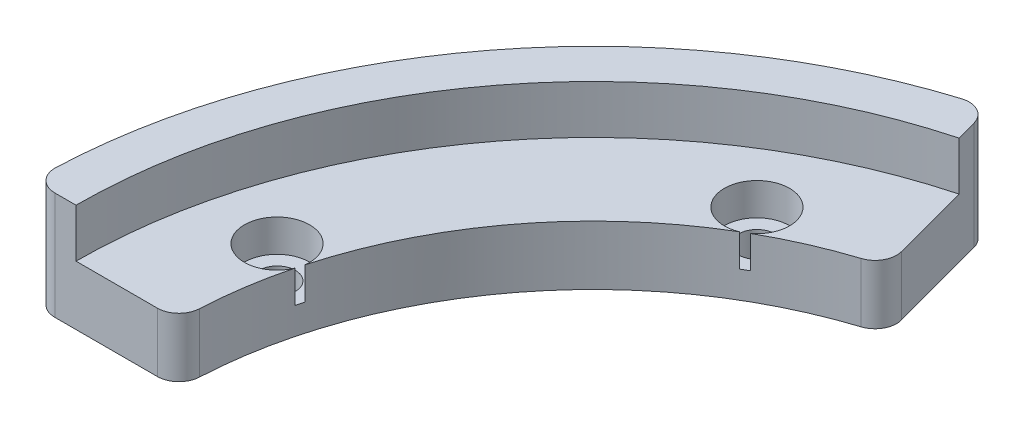
ISO-10303-21;
HEADER;
FILE_DESCRIPTION(('STEP AP214'),'2;1');
FILE_NAME('part.step','',(''),(''),'','','');
FILE_SCHEMA(('AUTOMOTIVE_DESIGN { 1 0 10303 214 1 1 1 1 }'));
ENDSEC;
DATA;
#1=APPLICATION_CONTEXT('core data for automotive mechanical design processes');
#2=APPLICATION_PROTOCOL_DEFINITION('international standard','automotive_design',2000,#1);
#3=PRODUCT_CONTEXT('',#1,'mechanical');
#4=PRODUCT('Part','Part','',(#3));
#5=PRODUCT_RELATED_PRODUCT_CATEGORY('part','',(#4));
#6=PRODUCT_DEFINITION_FORMATION('','',#4);
#7=PRODUCT_DEFINITION_CONTEXT('part definition',#1,'design');
#8=PRODUCT_DEFINITION('design','',#6,#7);
#9=PRODUCT_DEFINITION_SHAPE('','',#8);
#10=(LENGTH_UNIT() NAMED_UNIT(*) SI_UNIT(.MILLI.,.METRE.));
#11=(NAMED_UNIT(*) PLANE_ANGLE_UNIT() SI_UNIT($,.RADIAN.));
#12=(NAMED_UNIT(*) SI_UNIT($,.STERADIAN.) SOLID_ANGLE_UNIT());
#13=UNCERTAINTY_MEASURE_WITH_UNIT(LENGTH_MEASURE(1.E-05),#10,'distance_accuracy_value','');
#14=(GEOMETRIC_REPRESENTATION_CONTEXT(3) GLOBAL_UNCERTAINTY_ASSIGNED_CONTEXT((#13)) GLOBAL_UNIT_ASSIGNED_CONTEXT((#10,
#11,#12)) REPRESENTATION_CONTEXT('',''));
#15=CARTESIAN_POINT('',(0.,0.,0.));
#16=DIRECTION('',(0.,0.,1.));
#17=DIRECTION('',(1.,0.,0.));
#18=AXIS2_PLACEMENT_3D('',#15,#16,#17);
#19=CARTESIAN_POINT('',(-13.4585903453309,0.,-50.2281429670316));
#20=DIRECTION('',(0.,-1.,0.));
#21=DIRECTION('',(0.,0.,-1.));
#22=AXIS2_PLACEMENT_3D('',#19,#20,#21);
#23=PLANE('',#22);
#24=CARTESIAN_POINT('',(-20.7500000000013,0.,-35.9400542570549));
#25=DIRECTION('',(0.,1.,0.));
#26=DIRECTION('',(0.,0.,1.));
#27=AXIS2_PLACEMENT_3D('',#24,#25,#26);
#28=CIRCLE('',#27,1.70000000000001);
#29=CARTESIAN_POINT('',(-20.7500000000013,0.,-34.2400542570549));
#30=VERTEX_POINT('',#29);
#31=EDGE_CURVE('E332',#30,#30,#28,.T.);
#32=ORIENTED_EDGE('',*,*,#31,.T.);
#33=EDGE_LOOP('',(#32));
#34=FACE_BOUND('',#33,.T.);
#35=CARTESIAN_POINT('',(0.,0.,0.));
#36=DIRECTION('',(0.,1.,0.));
#37=DIRECTION('',(0.,0.,1.));
#38=AXIS2_PLACEMENT_3D('',#35,#36,#37);
#39=CIRCLE('',#38,52.);
#40=CARTESIAN_POINT('',(-15.4569448815382,0.,-49.6496007529677));
#41=VERTEX_POINT('',#40);
#42=CARTESIAN_POINT('',(-51.9583833466747,0.,-2.08));
#43=VERTEX_POINT('',#42);
#44=EDGE_CURVE('E245',#41,#43,#39,.T.);
#45=ORIENTED_EDGE('',*,*,#44,.F.);
#46=CARTESIAN_POINT('',(-14.862447001479,0.,-47.7400007240074));
#47=DIRECTION('',(0.,-1.,0.));
#48=DIRECTION('',(0.,0.,-1.));
#49=AXIS2_PLACEMENT_3D('',#46,#47,#48);
#50=CIRCLE('',#49,2.);
#51=CARTESIAN_POINT('',(-12.9305953489009,0.,-48.2576388142125));
#52=VERTEX_POINT('',#51);
#53=EDGE_CURVE('E178',#41,#52,#50,.T.);
#54=ORIENTED_EDGE('',*,*,#53,.T.);
#55=DIRECTION('',(0.258819045102518,0.,0.965925826289069));
#56=VECTOR('',#55,1.);
#57=CARTESIAN_POINT('',(-13.4585903453309,0.,-50.2281429670316));
#58=LINE('',#57,#56);
#59=CARTESIAN_POINT('',(-10.4693823375046,0.,-39.0722668074319));
#60=VERTEX_POINT('',#59);
#61=EDGE_CURVE('E221',#52,#60,#58,.T.);
#62=ORIENTED_EDGE('',*,*,#61,.T.);
#63=CARTESIAN_POINT('',(-12.4012339900827,0.,-38.5546287172269));
#64=DIRECTION('',(0.,-1.,0.));
#65=DIRECTION('',(0.,0.,-1.));
#66=AXIS2_PLACEMENT_3D('',#63,#64,#65);
#67=CIRCLE('',#66,2.);
#68=CARTESIAN_POINT('',(-11.7888273732885,0.,-36.6506964348947));
#69=VERTEX_POINT('',#68);
#70=EDGE_CURVE('E176',#60,#69,#67,.T.);
#71=ORIENTED_EDGE('',*,*,#70,.T.);
#72=CARTESIAN_POINT('',(0.,0.,0.));
#73=DIRECTION('',(0.,1.,0.));
#74=DIRECTION('',(0.,0.,1.));
#75=AXIS2_PLACEMENT_3D('',#72,#73,#74);
#76=CIRCLE('',#75,38.5);
#77=CARTESIAN_POINT('',(-38.4530272815785,0.,-1.90123456790123));
#78=VERTEX_POINT('',#77);
#79=EDGE_CURVE('E241',#69,#78,#76,.T.);
#80=ORIENTED_EDGE('',*,*,#79,.T.);
#81=CARTESIAN_POINT('',(-40.4505871403618,0.,-2.));
#82=DIRECTION('',(0.,-1.,0.));
#83=DIRECTION('',(0.,0.,-1.));
#84=AXIS2_PLACEMENT_3D('',#81,#82,#83);
#85=CIRCLE('',#84,2.);
#86=CARTESIAN_POINT('',(-40.4505871403618,0.,0.));
#87=VERTEX_POINT('',#86);
#88=EDGE_CURVE('E172',#78,#87,#85,.T.);
#89=ORIENTED_EDGE('',*,*,#88,.T.);
#90=DIRECTION('',(1.,0.,0.));
#91=VECTOR('',#90,1.);
#92=CARTESIAN_POINT('',(-52.,0.,0.));
#93=LINE('',#92,#91);
#94=CARTESIAN_POINT('',(-49.9599839871872,0.,0.));
#95=VERTEX_POINT('',#94);
#96=EDGE_CURVE('E202',#95,#87,#93,.T.);
#97=ORIENTED_EDGE('',*,*,#96,.F.);
#98=CARTESIAN_POINT('',(-49.9599839871872,0.,-2.));
#99=DIRECTION('',(0.,-1.,0.));
#100=DIRECTION('',(0.,0.,-1.));
#101=AXIS2_PLACEMENT_3D('',#98,#99,#100);
#102=CIRCLE('',#101,2.);
#103=EDGE_CURVE('E174',#95,#43,#102,.T.);
#104=ORIENTED_EDGE('',*,*,#103,.T.);
#105=EDGE_LOOP('',(#45,#54,#62,#71,#80,#89,#97,#104));
#106=FACE_BOUND('',#105,.T.);
#107=CARTESIAN_POINT('',(-40.0859217909964,0.,-10.7409903717543));
#108=DIRECTION('',(0.,1.,0.));
#109=DIRECTION('',(0.,0.,1.));
#110=AXIS2_PLACEMENT_3D('',#107,#108,#109);
#111=CIRCLE('',#110,1.70000000000001);
#112=CARTESIAN_POINT('',(-40.0859217909964,0.,-9.04099037175433));
#113=VERTEX_POINT('',#112);
#114=EDGE_CURVE('E216',#113,#113,#111,.T.);
#115=ORIENTED_EDGE('',*,*,#114,.T.);
#116=EDGE_LOOP('',(#115));
#117=FACE_BOUND('',#116,.T.);
#118=ADVANCED_FACE('F37',(#34,#106,#117),#23,.T.);
#119=CARTESIAN_POINT('',(0.,0.,0.));
#120=DIRECTION('',(0.,1.,0.));
#121=DIRECTION('',(0.,0.,1.));
#122=AXIS2_PLACEMENT_3D('',#119,#120,#121);
#123=CYLINDRICAL_SURFACE('',#122,52.);
#124=CARTESIAN_POINT('',(0.,10.,0.));
#125=DIRECTION('',(0.,1.,0.));
#126=DIRECTION('',(0.,0.,1.));
#127=AXIS2_PLACEMENT_3D('',#124,#125,#126);
#128=CIRCLE('',#127,52.);
#129=CARTESIAN_POINT('',(-15.4569448815382,10.,-49.6496007529677));
#130=VERTEX_POINT('',#129);
#131=CARTESIAN_POINT('',(-51.9583833466747,10.,-2.08));
#132=VERTEX_POINT('',#131);
#133=EDGE_CURVE('E232',#130,#132,#128,.T.);
#134=ORIENTED_EDGE('',*,*,#133,.F.);
#135=DIRECTION('',(0.,1.,0.));
#136=VECTOR('',#135,1.);
#137=CARTESIAN_POINT('',(-15.4569448815382,0.,-49.6496007529677));
#138=LINE('',#137,#136);
#139=EDGE_CURVE('E164',#130,#41,#138,.F.);
#140=ORIENTED_EDGE('',*,*,#139,.T.);
#141=ORIENTED_EDGE('',*,*,#44,.T.);
#142=DIRECTION('',(0.,1.,0.));
#143=VECTOR('',#142,1.);
#144=CARTESIAN_POINT('',(-51.9583833466747,0.,-2.08));
#145=LINE('',#144,#143);
#146=EDGE_CURVE('E162',#43,#132,#145,.T.);
#147=ORIENTED_EDGE('',*,*,#146,.T.);
#148=EDGE_LOOP('',(#134,#140,#141,#147));
#149=FACE_BOUND('',#148,.T.);
#150=ADVANCED_FACE('F287',(#149),#123,.T.);
#151=CARTESIAN_POINT('',(0.,0.,0.));
#152=DIRECTION('',(0.,1.,0.));
#153=DIRECTION('',(0.,0.,1.));
#154=AXIS2_PLACEMENT_3D('',#151,#152,#153);
#155=CYLINDRICAL_SURFACE('',#154,38.5);
#156=ORIENTED_EDGE('',*,*,#79,.F.);
#157=DIRECTION('',(0.,1.,0.));
#158=VECTOR('',#157,1.);
#159=CARTESIAN_POINT('',(-11.7888273732885,0.,-36.6506964348947));
#160=LINE('',#159,#158);
#161=CARTESIAN_POINT('',(-11.7888273732885,5.5,-36.6506964348947));
#162=VERTEX_POINT('',#161);
#163=EDGE_CURVE('E190',#69,#162,#160,.T.);
#164=ORIENTED_EDGE('',*,*,#163,.T.);
#165=CARTESIAN_POINT('',(0.,5.5,0.));
#166=DIRECTION('',(0.,1.,0.));
#167=DIRECTION('',(0.,0.,1.));
#168=AXIS2_PLACEMENT_3D('',#165,#166,#167);
#169=CIRCLE('',#168,38.5);
#170=CARTESIAN_POINT('',(-18.9253645489168,5.5,-33.5273109075363));
#171=VERTEX_POINT('',#170);
#172=EDGE_CURVE('E239',#162,#171,#169,.T.);
#173=ORIENTED_EDGE('',*,*,#172,.T.);
#174=DIRECTION('',(0.,1.,0.));
#175=VECTOR('',#174,1.);
#176=CARTESIAN_POINT('',(-18.9253645489168,4.,-33.5273109075363));
#177=LINE('',#176,#175);
#178=CARTESIAN_POINT('',(-18.9253645489168,2.5,-33.5273109075363));
#179=VERTEX_POINT('',#178);
#180=EDGE_CURVE('E152',#179,#171,#177,.T.);
#181=ORIENTED_EDGE('',*,*,#180,.F.);
#182=CARTESIAN_POINT('',(0.,2.5,0.));
#183=DIRECTION('',(0.,-1.,0.));
#184=DIRECTION('',(0.,0.,-1.));
#185=AXIS2_PLACEMENT_3D('',#182,#183,#184);
#186=CIRCLE('',#185,38.5);
#187=CARTESIAN_POINT('',(-19.5728206920484,2.5,-33.1535019290108));
#188=VERTEX_POINT('',#187);
#189=EDGE_CURVE('E157',#188,#179,#186,.T.);
#190=ORIENTED_EDGE('',*,*,#189,.F.);
#191=DIRECTION('',(0.,1.,0.));
#192=VECTOR('',#191,1.);
#193=CARTESIAN_POINT('',(-19.5728206920484,4.,-33.1535019290108));
#194=LINE('',#193,#192);
#195=CARTESIAN_POINT('',(-19.5728206920484,5.5,-33.1535019290108));
#196=VERTEX_POINT('',#195);
#197=EDGE_CURVE('E140',#196,#188,#194,.F.);
#198=ORIENTED_EDGE('',*,*,#197,.F.);
#199=CARTESIAN_POINT('',(-37.0896425066326,5.5,-10.3251352887114));
#200=VERTEX_POINT('',#199);
#201=EDGE_CURVE('E242',#196,#200,#169,.T.);
#202=ORIENTED_EDGE('',*,*,#201,.T.);
#203=DIRECTION('',(0.,1.,0.));
#204=VECTOR('',#203,1.);
#205=CARTESIAN_POINT('',(-37.0896425066326,4.,-10.3251352887114));
#206=LINE('',#205,#204);
#207=CARTESIAN_POINT('',(-37.0896425066326,2.5,-10.3251352887114));
#208=VERTEX_POINT('',#207);
#209=EDGE_CURVE('E248',#208,#200,#206,.T.);
#210=ORIENTED_EDGE('',*,*,#209,.F.);
#211=CARTESIAN_POINT('',(0.,2.5,0.));
#212=DIRECTION('',(0.,-1.,0.));
#213=DIRECTION('',(0.,0.,-1.));
#214=AXIS2_PLACEMENT_3D('',#211,#212,#213);
#215=CIRCLE('',#214,38.5);
#216=CARTESIAN_POINT('',(-37.2831402723828,2.5,-9.6029917957805));
#217=VERTEX_POINT('',#216);
#218=EDGE_CURVE('E251',#217,#208,#215,.T.);
#219=ORIENTED_EDGE('',*,*,#218,.F.);
#220=DIRECTION('',(0.,1.,0.));
#221=VECTOR('',#220,1.);
#222=CARTESIAN_POINT('',(-37.2831402723828,4.,-9.6029917957805));
#223=LINE('',#222,#221);
#224=CARTESIAN_POINT('',(-37.2831402723828,5.5,-9.6029917957805));
#225=VERTEX_POINT('',#224);
#226=EDGE_CURVE('E166',#225,#217,#223,.F.);
#227=ORIENTED_EDGE('',*,*,#226,.F.);
#228=CARTESIAN_POINT('',(-38.4530272815785,5.5,-1.90123456790123));
#229=VERTEX_POINT('',#228);
#230=EDGE_CURVE('E238',#225,#229,#169,.T.);
#231=ORIENTED_EDGE('',*,*,#230,.T.);
#232=DIRECTION('',(0.,1.,0.));
#233=VECTOR('',#232,1.);
#234=CARTESIAN_POINT('',(-38.4530272815785,0.,-1.90123456790123));
#235=LINE('',#234,#233);
#236=EDGE_CURVE('E188',#229,#78,#235,.F.);
#237=ORIENTED_EDGE('',*,*,#236,.T.);
#238=EDGE_LOOP('',(#156,#164,#173,#181,#190,#198,#202,#210,#219,#227,#231,#237));
#239=FACE_BOUND('',#238,.T.);
#240=ADVANCED_FACE('F161',(#239),#155,.F.);
#241=CARTESIAN_POINT('',(-9.96453323644692,5.5,-37.1881443121292));
#242=DIRECTION('',(0.,1.,0.));
#243=DIRECTION('',(0.,0.,1.));
#244=AXIS2_PLACEMENT_3D('',#241,#242,#243);
#245=PLANE('',#244);
#246=ORIENTED_EDGE('',*,*,#172,.F.);
#247=CARTESIAN_POINT('',(-12.4012339900827,5.5,-38.5546287172269));
#248=DIRECTION('',(0.,1.,0.));
#249=DIRECTION('',(0.,0.,1.));
#250=AXIS2_PLACEMENT_3D('',#247,#248,#249);
#251=CIRCLE('',#250,2.);
#252=CARTESIAN_POINT('',(-10.4693823375046,5.5,-39.0722668074319));
#253=VERTEX_POINT('',#252);
#254=EDGE_CURVE('E60',#162,#253,#251,.T.);
#255=ORIENTED_EDGE('',*,*,#254,.T.);
#256=DIRECTION('',(-0.258819045102518,0.,-0.965925826289069));
#257=VECTOR('',#256,1.);
#258=CARTESIAN_POINT('',(-9.96453323644692,5.5,-37.1881443121292));
#259=LINE('',#258,#257);
#260=CARTESIAN_POINT('',(-12.4233141649208,5.5,-46.3644396618753));
#261=VERTEX_POINT('',#260);
#262=EDGE_CURVE('E224',#253,#261,#259,.T.);
#263=ORIENTED_EDGE('',*,*,#262,.T.);
#264=CARTESIAN_POINT('',(0.,5.5,0.));
#265=DIRECTION('',(0.,1.,0.));
#266=DIRECTION('',(0.,0.,1.));
#267=AXIS2_PLACEMENT_3D('',#264,#265,#266);
#268=CIRCLE('',#267,48.);
#269=CARTESIAN_POINT('',(-48.,5.5,0.));
#270=VERTEX_POINT('',#269);
#271=EDGE_CURVE('E210',#261,#270,#268,.T.);
#272=ORIENTED_EDGE('',*,*,#271,.T.);
#273=DIRECTION('',(-1.,0.,0.));
#274=VECTOR('',#273,1.);
#275=CARTESIAN_POINT('',(-38.5,5.5,0.));
#276=LINE('',#275,#274);
#277=CARTESIAN_POINT('',(-40.4505871403618,5.5,0.));
#278=VERTEX_POINT('',#277);
#279=EDGE_CURVE('E199',#278,#270,#276,.T.);
#280=ORIENTED_EDGE('',*,*,#279,.F.);
#281=CARTESIAN_POINT('',(-40.4505871403618,5.5,-2.));
#282=DIRECTION('',(0.,1.,0.));
#283=DIRECTION('',(0.,0.,1.));
#284=AXIS2_PLACEMENT_3D('',#281,#282,#283);
#285=CIRCLE('',#284,2.);
#286=EDGE_CURVE('E52',#278,#229,#285,.T.);
#287=ORIENTED_EDGE('',*,*,#286,.T.);
#288=ORIENTED_EDGE('',*,*,#230,.F.);
#289=CARTESIAN_POINT('',(-40.0859217909964,5.5,-10.7409903717543));
#290=DIRECTION('',(0.,1.,0.));
#291=DIRECTION('',(0.,0.,1.));
#292=AXIS2_PLACEMENT_3D('',#289,#290,#291);
#293=CIRCLE('',#292,3.02500000000009);
#294=EDGE_CURVE('E151',#200,#225,#293,.T.);
#295=ORIENTED_EDGE('',*,*,#294,.F.);
#296=ORIENTED_EDGE('',*,*,#201,.F.);
#297=CARTESIAN_POINT('',(-20.7500000000013,5.5,-35.9400542570549));
#298=DIRECTION('',(0.,1.,0.));
#299=DIRECTION('',(0.,0.,1.));
#300=AXIS2_PLACEMENT_3D('',#297,#298,#299);
#301=CIRCLE('',#300,3.02500000000009);
#302=EDGE_CURVE('E147',#171,#196,#301,.T.);
#303=ORIENTED_EDGE('',*,*,#302,.F.);
#304=EDGE_LOOP('',(#246,#255,#263,#272,#280,#287,#288,#295,#296,#303));
#305=FACE_BOUND('',#304,.T.);
#306=ADVANCED_FACE('F206',(#305),#245,.T.);
#307=CARTESIAN_POINT('',(0.,0.,0.));
#308=DIRECTION('',(0.,1.,0.));
#309=DIRECTION('',(0.,0.,1.));
#310=AXIS2_PLACEMENT_3D('',#307,#308,#309);
#311=CYLINDRICAL_SURFACE('',#310,48.);
#312=CARTESIAN_POINT('',(0.,10.,0.));
#313=DIRECTION('',(0.,1.,0.));
#314=DIRECTION('',(0.,0.,1.));
#315=AXIS2_PLACEMENT_3D('',#312,#313,#314);
#316=CIRCLE('',#315,48.);
#317=CARTESIAN_POINT('',(-12.4233141649208,10.,-46.3644396618753));
#318=VERTEX_POINT('',#317);
#319=CARTESIAN_POINT('',(-48.,10.,0.));
#320=VERTEX_POINT('',#319);
#321=EDGE_CURVE('E235',#318,#320,#316,.T.);
#322=ORIENTED_EDGE('',*,*,#321,.T.);
#323=DIRECTION('',(0.,1.,0.));
#324=VECTOR('',#323,1.);
#325=CARTESIAN_POINT('',(-48.,5.5,0.));
#326=LINE('',#325,#324);
#327=EDGE_CURVE('E212',#270,#320,#326,.T.);
#328=ORIENTED_EDGE('',*,*,#327,.F.);
#329=ORIENTED_EDGE('',*,*,#271,.F.);
#330=DIRECTION('',(0.,1.,0.));
#331=VECTOR('',#330,1.);
#332=CARTESIAN_POINT('',(-12.4233141649208,5.5,-46.3644396618753));
#333=LINE('',#332,#331);
#334=EDGE_CURVE('E226',#261,#318,#333,.T.);
#335=ORIENTED_EDGE('',*,*,#334,.T.);
#336=EDGE_LOOP('',(#322,#328,#329,#335));
#337=FACE_BOUND('',#336,.T.);
#338=ADVANCED_FACE('F320',(#337),#311,.F.);
#339=CARTESIAN_POINT('',(-12.4233141649208,10.,-46.3644396618753));
#340=DIRECTION('',(0.,1.,0.));
#341=DIRECTION('',(0.,0.,1.));
#342=AXIS2_PLACEMENT_3D('',#339,#340,#341);
#343=PLANE('',#342);
#344=DIRECTION('',(-0.258819045102518,0.,-0.965925826289069));
#345=VECTOR('',#344,1.);
#346=CARTESIAN_POINT('',(-12.4233141649208,10.,-46.3644396618753));
#347=LINE('',#346,#345);
#348=CARTESIAN_POINT('',(-12.9305953489009,10.,-48.2576388142125));
#349=VERTEX_POINT('',#348);
#350=EDGE_CURVE('E229',#318,#349,#347,.T.);
#351=ORIENTED_EDGE('',*,*,#350,.T.);
#352=CARTESIAN_POINT('',(-14.862447001479,10.,-47.7400007240074));
#353=DIRECTION('',(0.,1.,0.));
#354=DIRECTION('',(0.,0.,1.));
#355=AXIS2_PLACEMENT_3D('',#352,#353,#354);
#356=CIRCLE('',#355,2.);
#357=EDGE_CURVE('E186',#349,#130,#356,.T.);
#358=ORIENTED_EDGE('',*,*,#357,.T.);
#359=ORIENTED_EDGE('',*,*,#133,.T.);
#360=CARTESIAN_POINT('',(-49.9599839871872,10.,-2.));
#361=DIRECTION('',(0.,1.,0.));
#362=DIRECTION('',(0.,0.,1.));
#363=AXIS2_PLACEMENT_3D('',#360,#361,#362);
#364=CIRCLE('',#363,2.);
#365=CARTESIAN_POINT('',(-49.9599839871872,10.,0.));
#366=VERTEX_POINT('',#365);
#367=EDGE_CURVE('E184',#132,#366,#364,.T.);
#368=ORIENTED_EDGE('',*,*,#367,.T.);
#369=DIRECTION('',(-1.,0.,0.));
#370=VECTOR('',#369,1.);
#371=CARTESIAN_POINT('',(-48.,10.,0.));
#372=LINE('',#371,#370);
#373=EDGE_CURVE('E214',#320,#366,#372,.T.);
#374=ORIENTED_EDGE('',*,*,#373,.F.);
#375=ORIENTED_EDGE('',*,*,#321,.F.);
#376=EDGE_LOOP('',(#351,#358,#359,#368,#374,#375));
#377=FACE_BOUND('',#376,.T.);
#378=ADVANCED_FACE('F317',(#377),#343,.T.);
#379=CARTESIAN_POINT('',(0.,0.,0.));
#380=DIRECTION('',(-0.965925826289069,0.,0.258819045102518));
#381=DIRECTION('',(0.258819045102518,0.,0.965925826289069));
#382=AXIS2_PLACEMENT_3D('',#379,#380,#381);
#383=PLANE('',#382);
#384=ORIENTED_EDGE('',*,*,#61,.F.);
#385=DIRECTION('',(0.,-1.,0.));
#386=VECTOR('',#385,1.);
#387=CARTESIAN_POINT('',(-12.9305953489009,10.,-48.2576388142125));
#388=LINE('',#387,#386);
#389=EDGE_CURVE('E182',#52,#349,#388,.F.);
#390=ORIENTED_EDGE('',*,*,#389,.T.);
#391=ORIENTED_EDGE('',*,*,#350,.F.);
#392=ORIENTED_EDGE('',*,*,#334,.F.);
#393=ORIENTED_EDGE('',*,*,#262,.F.);
#394=DIRECTION('',(0.,-1.,0.));
#395=VECTOR('',#394,1.);
#396=CARTESIAN_POINT('',(-10.4693823375046,0.,-39.0722668074319));
#397=LINE('',#396,#395);
#398=EDGE_CURVE('E180',#253,#60,#397,.T.);
#399=ORIENTED_EDGE('',*,*,#398,.T.);
#400=EDGE_LOOP('',(#384,#390,#391,#392,#393,#399));
#401=FACE_BOUND('',#400,.T.);
#402=ADVANCED_FACE('F330',(#401),#383,.F.);
#403=CARTESIAN_POINT('',(0.,0.,0.));
#404=DIRECTION('',(0.,0.,1.));
#405=DIRECTION('',(1.,0.,0.));
#406=AXIS2_PLACEMENT_3D('',#403,#404,#405);
#407=PLANE('',#406);
#408=ORIENTED_EDGE('',*,*,#373,.T.);
#409=DIRECTION('',(0.,1.,0.));
#410=VECTOR('',#409,1.);
#411=CARTESIAN_POINT('',(-49.9599839871872,0.,0.));
#412=LINE('',#411,#410);
#413=EDGE_CURVE('E11',#366,#95,#412,.F.);
#414=ORIENTED_EDGE('',*,*,#413,.T.);
#415=ORIENTED_EDGE('',*,*,#96,.T.);
#416=DIRECTION('',(0.,1.,0.));
#417=VECTOR('',#416,1.);
#418=CARTESIAN_POINT('',(-40.4505871403618,0.,0.));
#419=LINE('',#418,#417);
#420=EDGE_CURVE('E45',#87,#278,#419,.T.);
#421=ORIENTED_EDGE('',*,*,#420,.T.);
#422=ORIENTED_EDGE('',*,*,#279,.T.);
#423=ORIENTED_EDGE('',*,*,#327,.T.);
#424=EDGE_LOOP('',(#408,#414,#415,#421,#422,#423));
#425=FACE_BOUND('',#424,.T.);
#426=ADVANCED_FACE('F197',(#425),#407,.T.);
#427=CARTESIAN_POINT('',(-40.0859217909964,5.5,-10.7409903717543));
#428=DIRECTION('',(0.,1.,0.));
#429=DIRECTION('',(0.,0.,1.));
#430=AXIS2_PLACEMENT_3D('',#427,#428,#429);
#431=CYLINDRICAL_SURFACE('',#430,1.70000000000001);
#432=ORIENTED_EDGE('',*,*,#114,.F.);
#433=EDGE_LOOP('',(#432));
#434=FACE_BOUND('',#433,.T.);
#435=CARTESIAN_POINT('',(-40.0859217909964,2.5,-10.7409903717543));
#436=DIRECTION('',(0.,1.,0.));
#437=DIRECTION('',(0.,0.,1.));
#438=AXIS2_PLACEMENT_3D('',#435,#436,#437);
#439=CIRCLE('',#438,1.70000000000001);
#440=CARTESIAN_POINT('',(-40.0859217909964,2.5,-9.04099037175433));
#441=VERTEX_POINT('',#440);
#442=EDGE_CURVE('E264',#441,#441,#439,.T.);
#443=ORIENTED_EDGE('',*,*,#442,.T.);
#444=EDGE_LOOP('',(#443));
#445=FACE_BOUND('',#444,.T.);
#446=ADVANCED_FACE('F274',(#434,#445),#431,.F.);
#447=CARTESIAN_POINT('',(-38.3859217909964,2.5,-10.7409903717543));
#448=DIRECTION('',(0.,-1.,0.));
#449=DIRECTION('',(0.,0.,-1.));
#450=AXIS2_PLACEMENT_3D('',#447,#448,#449);
#451=PLANE('',#450);
#452=ORIENTED_EDGE('',*,*,#218,.T.);
#453=CARTESIAN_POINT('',(-40.0859217909964,2.5,-10.7409903717543));
#454=DIRECTION('',(0.,1.,0.));
#455=DIRECTION('',(0.,0.,1.));
#456=AXIS2_PLACEMENT_3D('',#453,#454,#455);
#457=CIRCLE('',#456,3.02500000000009);
#458=EDGE_CURVE('E257',#208,#217,#457,.T.);
#459=ORIENTED_EDGE('',*,*,#458,.T.);
#460=EDGE_LOOP('',(#452,#459));
#461=FACE_BOUND('',#460,.T.);
#462=ORIENTED_EDGE('',*,*,#442,.F.);
#463=EDGE_LOOP('',(#462));
#464=FACE_BOUND('',#463,.T.);
#465=ADVANCED_FACE('F261',(#461,#464),#451,.F.);
#466=CARTESIAN_POINT('',(-40.0859217909964,5.5,-10.7409903717543));
#467=DIRECTION('',(0.,1.,0.));
#468=DIRECTION('',(0.,0.,1.));
#469=AXIS2_PLACEMENT_3D('',#466,#467,#468);
#470=CYLINDRICAL_SURFACE('',#469,3.02500000000009);
#471=ORIENTED_EDGE('',*,*,#226,.T.);
#472=ORIENTED_EDGE('',*,*,#458,.F.);
#473=ORIENTED_EDGE('',*,*,#209,.T.);
#474=ORIENTED_EDGE('',*,*,#294,.T.);
#475=EDGE_LOOP('',(#471,#472,#473,#474));
#476=FACE_BOUND('',#475,.T.);
#477=ADVANCED_FACE('F256',(#476),#470,.F.);
#478=CARTESIAN_POINT('',(-20.7500000000013,5.5,-35.9400542570549));
#479=DIRECTION('',(0.,1.,0.));
#480=DIRECTION('',(0.,0.,1.));
#481=AXIS2_PLACEMENT_3D('',#478,#479,#480);
#482=CYLINDRICAL_SURFACE('',#481,1.70000000000001);
#483=ORIENTED_EDGE('',*,*,#31,.F.);
#484=EDGE_LOOP('',(#483));
#485=FACE_BOUND('',#484,.T.);
#486=CARTESIAN_POINT('',(-20.7500000000013,2.5,-35.9400542570549));
#487=DIRECTION('',(0.,1.,0.));
#488=DIRECTION('',(0.,0.,1.));
#489=AXIS2_PLACEMENT_3D('',#486,#487,#488);
#490=CIRCLE('',#489,1.70000000000001);
#491=CARTESIAN_POINT('',(-20.7500000000013,2.5,-34.2400542570549));
#492=VERTEX_POINT('',#491);
#493=EDGE_CURVE('E158',#492,#492,#490,.T.);
#494=ORIENTED_EDGE('',*,*,#493,.T.);
#495=EDGE_LOOP('',(#494));
#496=FACE_BOUND('',#495,.T.);
#497=ADVANCED_FACE('F284',(#485,#496),#482,.F.);
#498=CARTESIAN_POINT('',(-19.0500000000013,2.5,-35.9400542570549));
#499=DIRECTION('',(0.,-1.,0.));
#500=DIRECTION('',(0.,0.,-1.));
#501=AXIS2_PLACEMENT_3D('',#498,#499,#500);
#502=PLANE('',#501);
#503=ORIENTED_EDGE('',*,*,#189,.T.);
#504=CARTESIAN_POINT('',(-20.7500000000013,2.5,-35.9400542570549));
#505=DIRECTION('',(0.,1.,0.));
#506=DIRECTION('',(0.,0.,1.));
#507=AXIS2_PLACEMENT_3D('',#504,#505,#506);
#508=CIRCLE('',#507,3.02500000000009);
#509=EDGE_CURVE('E144',#179,#188,#508,.T.);
#510=ORIENTED_EDGE('',*,*,#509,.T.);
#511=EDGE_LOOP('',(#503,#510));
#512=FACE_BOUND('',#511,.T.);
#513=ORIENTED_EDGE('',*,*,#493,.F.);
#514=EDGE_LOOP('',(#513));
#515=FACE_BOUND('',#514,.T.);
#516=ADVANCED_FACE('F155',(#512,#515),#502,.F.);
#517=CARTESIAN_POINT('',(-20.7500000000013,5.5,-35.9400542570549));
#518=DIRECTION('',(0.,1.,0.));
#519=DIRECTION('',(0.,0.,1.));
#520=AXIS2_PLACEMENT_3D('',#517,#518,#519);
#521=CYLINDRICAL_SURFACE('',#520,3.02500000000009);
#522=ORIENTED_EDGE('',*,*,#197,.T.);
#523=ORIENTED_EDGE('',*,*,#509,.F.);
#524=ORIENTED_EDGE('',*,*,#180,.T.);
#525=ORIENTED_EDGE('',*,*,#302,.T.);
#526=EDGE_LOOP('',(#522,#523,#524,#525));
#527=FACE_BOUND('',#526,.T.);
#528=ADVANCED_FACE('F142',(#527),#521,.F.);
#529=CARTESIAN_POINT('',(-14.862447001479,0.,-47.7400007240074));
#530=DIRECTION('',(0.,1.,0.));
#531=DIRECTION('',(0.,0.,1.));
#532=AXIS2_PLACEMENT_3D('',#529,#530,#531);
#533=CYLINDRICAL_SURFACE('',#532,2.);
#534=ORIENTED_EDGE('',*,*,#357,.F.);
#535=ORIENTED_EDGE('',*,*,#389,.F.);
#536=ORIENTED_EDGE('',*,*,#53,.F.);
#537=ORIENTED_EDGE('',*,*,#139,.F.);
#538=EDGE_LOOP('',(#534,#535,#536,#537));
#539=FACE_BOUND('',#538,.T.);
#540=ADVANCED_FACE('F300',(#539),#533,.T.);
#541=CARTESIAN_POINT('',(-12.4012339900827,0.,-38.5546287172269));
#542=DIRECTION('',(0.,1.,0.));
#543=DIRECTION('',(0.,0.,1.));
#544=AXIS2_PLACEMENT_3D('',#541,#542,#543);
#545=CYLINDRICAL_SURFACE('',#544,2.);
#546=ORIENTED_EDGE('',*,*,#70,.F.);
#547=ORIENTED_EDGE('',*,*,#398,.F.);
#548=ORIENTED_EDGE('',*,*,#254,.F.);
#549=ORIENTED_EDGE('',*,*,#163,.F.);
#550=EDGE_LOOP('',(#546,#547,#548,#549));
#551=FACE_BOUND('',#550,.T.);
#552=ADVANCED_FACE('F303',(#551),#545,.T.);
#553=CARTESIAN_POINT('',(-49.9599839871872,0.,-2.));
#554=DIRECTION('',(0.,1.,0.));
#555=DIRECTION('',(0.,0.,1.));
#556=AXIS2_PLACEMENT_3D('',#553,#554,#555);
#557=CYLINDRICAL_SURFACE('',#556,2.);
#558=ORIENTED_EDGE('',*,*,#367,.F.);
#559=ORIENTED_EDGE('',*,*,#146,.F.);
#560=ORIENTED_EDGE('',*,*,#103,.F.);
#561=ORIENTED_EDGE('',*,*,#413,.F.);
#562=EDGE_LOOP('',(#558,#559,#560,#561));
#563=FACE_BOUND('',#562,.T.);
#564=ADVANCED_FACE('F306',(#563),#557,.T.);
#565=CARTESIAN_POINT('',(-40.4505871403618,0.,-2.));
#566=DIRECTION('',(0.,1.,0.));
#567=DIRECTION('',(0.,0.,1.));
#568=AXIS2_PLACEMENT_3D('',#565,#566,#567);
#569=CYLINDRICAL_SURFACE('',#568,2.);
#570=ORIENTED_EDGE('',*,*,#88,.F.);
#571=ORIENTED_EDGE('',*,*,#236,.F.);
#572=ORIENTED_EDGE('',*,*,#286,.F.);
#573=ORIENTED_EDGE('',*,*,#420,.F.);
#574=EDGE_LOOP('',(#570,#571,#572,#573));
#575=FACE_BOUND('',#574,.T.);
#576=ADVANCED_FACE('F39',(#575),#569,.T.);
#577=CLOSED_SHELL('',(#118,#150,#240,#306,#338,#378,#402,#426,#446,#465,#477,#497,#516,#528,
#540,#552,#564,#576));
#578=MANIFOLD_SOLID_BREP('B2',#577);
#579=ADVANCED_BREP_SHAPE_REPRESENTATION('',(#18,#578),#14);
#580=SHAPE_DEFINITION_REPRESENTATION(#9,#579);
ENDSEC;
END-ISO-10303-21;
